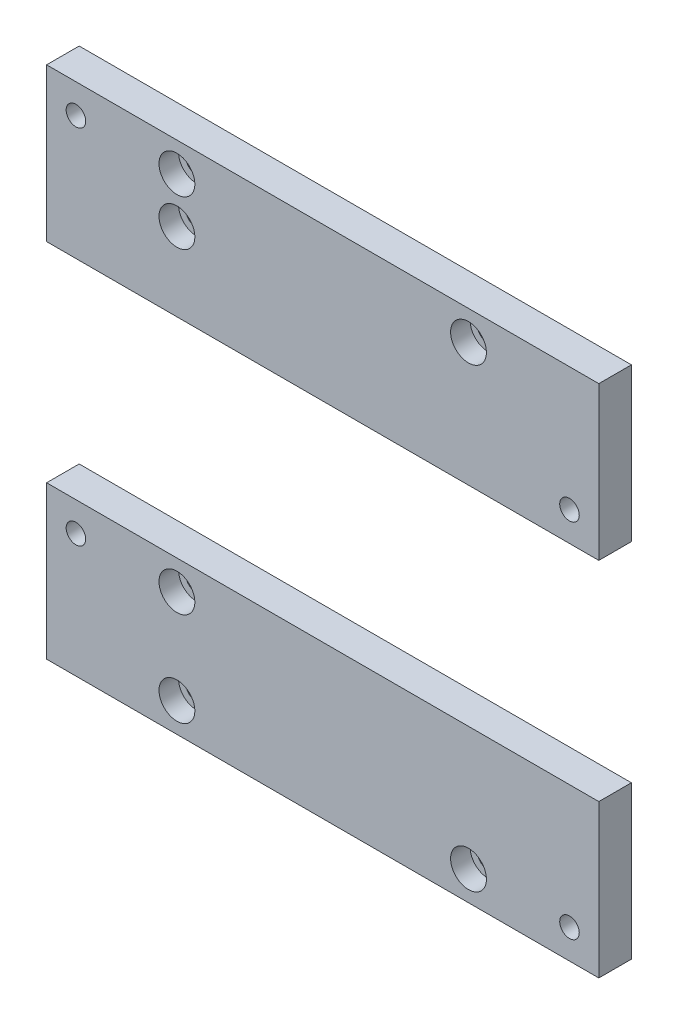
ISO-10303-21;
HEADER;
FILE_DESCRIPTION(('STEP AP214'),'2;1');
FILE_NAME('part.step','',(''),(''),'','','');
FILE_SCHEMA(('AUTOMOTIVE_DESIGN { 1 0 10303 214 1 1 1 1 }'));
ENDSEC;
DATA;
#1=APPLICATION_CONTEXT('core data for automotive mechanical design processes');
#2=APPLICATION_PROTOCOL_DEFINITION('international standard','automotive_design',2000,#1);
#3=PRODUCT_CONTEXT('',#1,'mechanical');
#4=PRODUCT('Part','Part','',(#3));
#5=PRODUCT_RELATED_PRODUCT_CATEGORY('part','',(#4));
#6=PRODUCT_DEFINITION_FORMATION('','',#4);
#7=PRODUCT_DEFINITION_CONTEXT('part definition',#1,'design');
#8=PRODUCT_DEFINITION('design','',#6,#7);
#9=PRODUCT_DEFINITION_SHAPE('','',#8);
#10=(LENGTH_UNIT() NAMED_UNIT(*) SI_UNIT(.MILLI.,.METRE.));
#11=(NAMED_UNIT(*) PLANE_ANGLE_UNIT() SI_UNIT($,.RADIAN.));
#12=(NAMED_UNIT(*) SI_UNIT($,.STERADIAN.) SOLID_ANGLE_UNIT());
#13=UNCERTAINTY_MEASURE_WITH_UNIT(LENGTH_MEASURE(1.E-05),#10,'distance_accuracy_value','');
#14=(GEOMETRIC_REPRESENTATION_CONTEXT(3) GLOBAL_UNCERTAINTY_ASSIGNED_CONTEXT((#13)) GLOBAL_UNIT_ASSIGNED_CONTEXT((#10,
#11,#12)) REPRESENTATION_CONTEXT('',''));
#15=CARTESIAN_POINT('',(0.,0.,0.));
#16=DIRECTION('',(0.,0.,1.));
#17=DIRECTION('',(1.,0.,0.));
#18=AXIS2_PLACEMENT_3D('',#15,#16,#17);
#19=CARTESIAN_POINT('',(-50.,79.0000000000001,10.));
#20=DIRECTION('',(1.,0.,0.));
#21=DIRECTION('',(0.,1.,0.));
#22=AXIS2_PLACEMENT_3D('',#19,#20,#21);
#23=PLANE('',#22);
#24=DIRECTION('',(0.,-1.,0.));
#25=VECTOR('',#24,1.);
#26=CARTESIAN_POINT('',(-50.,79.0000000000001,0.));
#27=LINE('',#26,#25);
#28=CARTESIAN_POINT('',(-50.,79.0000000000001,0.));
#29=VERTEX_POINT('',#28);
#30=CARTESIAN_POINT('',(-50.,32.,0.));
#31=VERTEX_POINT('',#30);
#32=EDGE_CURVE('E12',#29,#31,#27,.T.);
#33=ORIENTED_EDGE('',*,*,#32,.T.);
#34=DIRECTION('',(0.,0.,-1.));
#35=VECTOR('',#34,1.);
#36=CARTESIAN_POINT('',(-50.,32.,10.));
#37=LINE('',#36,#35);
#38=CARTESIAN_POINT('',(-50.,32.,10.));
#39=VERTEX_POINT('',#38);
#40=EDGE_CURVE('E119',#39,#31,#37,.T.);
#41=ORIENTED_EDGE('',*,*,#40,.F.);
#42=DIRECTION('',(0.,-1.,0.));
#43=VECTOR('',#42,1.);
#44=CARTESIAN_POINT('',(-50.,79.0000000000001,10.));
#45=LINE('',#44,#43);
#46=CARTESIAN_POINT('',(-50.,79.0000000000001,10.));
#47=VERTEX_POINT('',#46);
#48=EDGE_CURVE('E52',#47,#39,#45,.T.);
#49=ORIENTED_EDGE('',*,*,#48,.F.);
#50=DIRECTION('',(0.,0.,-1.));
#51=VECTOR('',#50,1.);
#52=CARTESIAN_POINT('',(-50.,79.0000000000001,10.));
#53=LINE('',#52,#51);
#54=EDGE_CURVE('E107',#47,#29,#53,.T.);
#55=ORIENTED_EDGE('',*,*,#54,.T.);
#56=EDGE_LOOP('',(#33,#41,#49,#55));
#57=FACE_BOUND('',#56,.T.);
#58=ADVANCED_FACE('F48',(#57),#23,.F.);
#59=CARTESIAN_POINT('',(-50.,32.,10.));
#60=DIRECTION('',(0.,1.,0.));
#61=DIRECTION('',(0.,0.,1.));
#62=AXIS2_PLACEMENT_3D('',#59,#60,#61);
#63=PLANE('',#62);
#64=DIRECTION('',(1.,0.,0.));
#65=VECTOR('',#64,1.);
#66=CARTESIAN_POINT('',(-50.,32.,0.));
#67=LINE('',#66,#65);
#68=CARTESIAN_POINT('',(119.5,32.,0.));
#69=VERTEX_POINT('',#68);
#70=EDGE_CURVE('E58',#31,#69,#67,.T.);
#71=ORIENTED_EDGE('',*,*,#70,.T.);
#72=DIRECTION('',(0.,0.,-1.));
#73=VECTOR('',#72,1.);
#74=CARTESIAN_POINT('',(119.5,32.,10.));
#75=LINE('',#74,#73);
#76=CARTESIAN_POINT('',(119.5,32.,10.));
#77=VERTEX_POINT('',#76);
#78=EDGE_CURVE('E103',#77,#69,#75,.T.);
#79=ORIENTED_EDGE('',*,*,#78,.F.);
#80=DIRECTION('',(1.,0.,0.));
#81=VECTOR('',#80,1.);
#82=CARTESIAN_POINT('',(-50.,32.,10.));
#83=LINE('',#82,#81);
#84=EDGE_CURVE('E82',#39,#77,#83,.T.);
#85=ORIENTED_EDGE('',*,*,#84,.F.);
#86=ORIENTED_EDGE('',*,*,#40,.T.);
#87=EDGE_LOOP('',(#71,#79,#85,#86));
#88=FACE_BOUND('',#87,.T.);
#89=ADVANCED_FACE('F202',(#88),#63,.F.);
#90=CARTESIAN_POINT('',(119.5,79.0000000000001,10.));
#91=DIRECTION('',(-1.,0.,0.));
#92=DIRECTION('',(0.,-1.,0.));
#93=AXIS2_PLACEMENT_3D('',#90,#91,#92);
#94=PLANE('',#93);
#95=DIRECTION('',(0.,1.,0.));
#96=VECTOR('',#95,1.);
#97=CARTESIAN_POINT('',(119.5,79.0000000000001,0.));
#98=LINE('',#97,#96);
#99=CARTESIAN_POINT('',(119.5,79.0000000000001,0.));
#100=VERTEX_POINT('',#99);
#101=EDGE_CURVE('E98',#69,#100,#98,.T.);
#102=ORIENTED_EDGE('',*,*,#101,.T.);
#103=DIRECTION('',(0.,0.,-1.));
#104=VECTOR('',#103,1.);
#105=CARTESIAN_POINT('',(119.5,79.0000000000001,10.));
#106=LINE('',#105,#104);
#107=CARTESIAN_POINT('',(119.5,79.0000000000001,10.));
#108=VERTEX_POINT('',#107);
#109=EDGE_CURVE('E101',#108,#100,#106,.T.);
#110=ORIENTED_EDGE('',*,*,#109,.F.);
#111=DIRECTION('',(0.,1.,0.));
#112=VECTOR('',#111,1.);
#113=CARTESIAN_POINT('',(119.5,79.0000000000001,10.));
#114=LINE('',#113,#112);
#115=EDGE_CURVE('E115',#77,#108,#114,.T.);
#116=ORIENTED_EDGE('',*,*,#115,.F.);
#117=ORIENTED_EDGE('',*,*,#78,.T.);
#118=EDGE_LOOP('',(#102,#110,#116,#117));
#119=FACE_BOUND('',#118,.T.);
#120=ADVANCED_FACE('F99',(#119),#94,.F.);
#121=CARTESIAN_POINT('',(-50.,79.0000000000001,10.));
#122=DIRECTION('',(0.,-1.,0.));
#123=DIRECTION('',(0.,0.,-1.));
#124=AXIS2_PLACEMENT_3D('',#121,#122,#123);
#125=PLANE('',#124);
#126=DIRECTION('',(-1.,0.,0.));
#127=VECTOR('',#126,1.);
#128=CARTESIAN_POINT('',(-50.,79.0000000000001,0.));
#129=LINE('',#128,#127);
#130=EDGE_CURVE('E92',#100,#29,#129,.T.);
#131=ORIENTED_EDGE('',*,*,#130,.T.);
#132=ORIENTED_EDGE('',*,*,#54,.F.);
#133=DIRECTION('',(-1.,0.,0.));
#134=VECTOR('',#133,1.);
#135=CARTESIAN_POINT('',(-50.,79.0000000000001,10.));
#136=LINE('',#135,#134);
#137=EDGE_CURVE('E106',#108,#47,#136,.T.);
#138=ORIENTED_EDGE('',*,*,#137,.F.);
#139=ORIENTED_EDGE('',*,*,#109,.T.);
#140=EDGE_LOOP('',(#131,#132,#138,#139));
#141=FACE_BOUND('',#140,.T.);
#142=ADVANCED_FACE('F105',(#141),#125,.F.);
#143=CARTESIAN_POINT('',(0.,0.,10.));
#144=DIRECTION('',(0.,0.,1.));
#145=DIRECTION('',(1.,0.,0.));
#146=AXIS2_PLACEMENT_3D('',#143,#144,#145);
#147=PLANE('',#146);
#148=CARTESIAN_POINT('',(-41.,70.0000000000001,10.));
#149=DIRECTION('',(0.,0.,1.));
#150=DIRECTION('',(1.,0.,0.));
#151=AXIS2_PLACEMENT_3D('',#148,#149,#150);
#152=CIRCLE('',#151,2.99999999999999);
#153=CARTESIAN_POINT('',(-38.,70.0000000000001,10.));
#154=VERTEX_POINT('',#153);
#155=EDGE_CURVE('E168',#154,#154,#152,.T.);
#156=ORIENTED_EDGE('',*,*,#155,.F.);
#157=EDGE_LOOP('',(#156));
#158=FACE_BOUND('',#157,.T.);
#159=CARTESIAN_POINT('',(110.5,41.,10.));
#160=DIRECTION('',(0.,0.,1.));
#161=DIRECTION('',(1.,0.,0.));
#162=AXIS2_PLACEMENT_3D('',#159,#160,#161);
#163=CIRCLE('',#162,2.99999999999999);
#164=CARTESIAN_POINT('',(113.5,41.,10.));
#165=VERTEX_POINT('',#164);
#166=EDGE_CURVE('E162',#165,#165,#163,.T.);
#167=ORIENTED_EDGE('',*,*,#166,.F.);
#168=EDGE_LOOP('',(#167));
#169=FACE_BOUND('',#168,.T.);
#170=CARTESIAN_POINT('',(79.5,70.0000000000001,10.));
#171=DIRECTION('',(0.,0.,1.));
#172=DIRECTION('',(1.,0.,0.));
#173=AXIS2_PLACEMENT_3D('',#170,#171,#172);
#174=CIRCLE('',#173,5.49999999999999);
#175=CARTESIAN_POINT('',(85.,70.0000000000001,10.));
#176=VERTEX_POINT('',#175);
#177=EDGE_CURVE('E156',#176,#176,#174,.T.);
#178=ORIENTED_EDGE('',*,*,#177,.F.);
#179=EDGE_LOOP('',(#178));
#180=FACE_BOUND('',#179,.T.);
#181=CARTESIAN_POINT('',(-10.,56.0000000000001,10.));
#182=DIRECTION('',(0.,0.,1.));
#183=DIRECTION('',(1.,0.,0.));
#184=AXIS2_PLACEMENT_3D('',#181,#182,#183);
#185=CIRCLE('',#184,5.49999999999999);
#186=CARTESIAN_POINT('',(-4.50000000000005,56.0000000000001,10.));
#187=VERTEX_POINT('',#186);
#188=EDGE_CURVE('E144',#187,#187,#185,.T.);
#189=ORIENTED_EDGE('',*,*,#188,.F.);
#190=EDGE_LOOP('',(#189));
#191=FACE_BOUND('',#190,.T.);
#192=CARTESIAN_POINT('',(-10.,70.0000000000001,10.));
#193=DIRECTION('',(0.,0.,1.));
#194=DIRECTION('',(1.,0.,0.));
#195=AXIS2_PLACEMENT_3D('',#192,#193,#194);
#196=CIRCLE('',#195,5.49999999999999);
#197=CARTESIAN_POINT('',(-4.50000000000004,70.0000000000001,10.));
#198=VERTEX_POINT('',#197);
#199=EDGE_CURVE('E132',#198,#198,#196,.T.);
#200=ORIENTED_EDGE('',*,*,#199,.F.);
#201=EDGE_LOOP('',(#200));
#202=FACE_BOUND('',#201,.T.);
#203=ORIENTED_EDGE('',*,*,#48,.T.);
#204=ORIENTED_EDGE('',*,*,#84,.T.);
#205=ORIENTED_EDGE('',*,*,#115,.T.);
#206=ORIENTED_EDGE('',*,*,#137,.T.);
#207=EDGE_LOOP('',(#203,#204,#205,#206));
#208=FACE_BOUND('',#207,.T.);
#209=ADVANCED_FACE('F50',(#158,#169,#180,#191,#202,#208),#147,.T.);
#210=CARTESIAN_POINT('',(0.,0.,0.));
#211=DIRECTION('',(0.,0.,1.));
#212=DIRECTION('',(1.,0.,0.));
#213=AXIS2_PLACEMENT_3D('',#210,#211,#212);
#214=PLANE('',#213);
#215=CARTESIAN_POINT('',(-41.,70.0000000000001,0.));
#216=DIRECTION('',(0.,0.,1.));
#217=DIRECTION('',(1.,0.,0.));
#218=AXIS2_PLACEMENT_3D('',#215,#216,#217);
#219=CIRCLE('',#218,2.99999999999999);
#220=CARTESIAN_POINT('',(-38.,70.0000000000001,0.));
#221=VERTEX_POINT('',#220);
#222=EDGE_CURVE('E165',#221,#221,#219,.T.);
#223=ORIENTED_EDGE('',*,*,#222,.T.);
#224=EDGE_LOOP('',(#223));
#225=FACE_BOUND('',#224,.T.);
#226=CARTESIAN_POINT('',(110.5,41.,0.));
#227=DIRECTION('',(0.,0.,1.));
#228=DIRECTION('',(1.,0.,0.));
#229=AXIS2_PLACEMENT_3D('',#226,#227,#228);
#230=CIRCLE('',#229,2.99999999999999);
#231=CARTESIAN_POINT('',(113.5,41.,0.));
#232=VERTEX_POINT('',#231);
#233=EDGE_CURVE('E159',#232,#232,#230,.T.);
#234=ORIENTED_EDGE('',*,*,#233,.T.);
#235=EDGE_LOOP('',(#234));
#236=FACE_BOUND('',#235,.T.);
#237=CARTESIAN_POINT('',(79.5,70.0000000000001,0.));
#238=DIRECTION('',(0.,0.,1.));
#239=DIRECTION('',(1.,0.,0.));
#240=AXIS2_PLACEMENT_3D('',#237,#238,#239);
#241=CIRCLE('',#240,3.30000000000001);
#242=CARTESIAN_POINT('',(82.8,70.0000000000001,0.));
#243=VERTEX_POINT('',#242);
#244=EDGE_CURVE('E147',#243,#243,#241,.T.);
#245=ORIENTED_EDGE('',*,*,#244,.T.);
#246=EDGE_LOOP('',(#245));
#247=FACE_BOUND('',#246,.T.);
#248=CARTESIAN_POINT('',(-10.,56.0000000000001,0.));
#249=DIRECTION('',(0.,0.,1.));
#250=DIRECTION('',(1.,0.,0.));
#251=AXIS2_PLACEMENT_3D('',#248,#249,#250);
#252=CIRCLE('',#251,3.30000000000001);
#253=CARTESIAN_POINT('',(-6.70000000000003,56.0000000000001,0.));
#254=VERTEX_POINT('',#253);
#255=EDGE_CURVE('E135',#254,#254,#252,.T.);
#256=ORIENTED_EDGE('',*,*,#255,.T.);
#257=EDGE_LOOP('',(#256));
#258=FACE_BOUND('',#257,.T.);
#259=CARTESIAN_POINT('',(-10.,70.0000000000001,0.));
#260=DIRECTION('',(0.,0.,1.));
#261=DIRECTION('',(1.,0.,0.));
#262=AXIS2_PLACEMENT_3D('',#259,#260,#261);
#263=CIRCLE('',#262,3.30000000000001);
#264=CARTESIAN_POINT('',(-6.70000000000003,70.0000000000001,0.));
#265=VERTEX_POINT('',#264);
#266=EDGE_CURVE('E120',#265,#265,#263,.T.);
#267=ORIENTED_EDGE('',*,*,#266,.T.);
#268=EDGE_LOOP('',(#267));
#269=FACE_BOUND('',#268,.T.);
#270=ORIENTED_EDGE('',*,*,#32,.F.);
#271=ORIENTED_EDGE('',*,*,#130,.F.);
#272=ORIENTED_EDGE('',*,*,#101,.F.);
#273=ORIENTED_EDGE('',*,*,#70,.F.);
#274=EDGE_LOOP('',(#270,#271,#272,#273));
#275=FACE_BOUND('',#274,.T.);
#276=ADVANCED_FACE('F109',(#225,#236,#247,#258,#269,#275),#214,.F.);
#277=CARTESIAN_POINT('',(-10.,70.0000000000001,10.));
#278=DIRECTION('',(0.,0.,1.));
#279=DIRECTION('',(1.,0.,0.));
#280=AXIS2_PLACEMENT_3D('',#277,#278,#279);
#281=CYLINDRICAL_SURFACE('',#280,3.30000000000001);
#282=ORIENTED_EDGE('',*,*,#266,.F.);
#283=EDGE_LOOP('',(#282));
#284=FACE_BOUND('',#283,.T.);
#285=CARTESIAN_POINT('',(-10.,70.0000000000001,4.));
#286=DIRECTION('',(0.,0.,1.));
#287=DIRECTION('',(1.,0.,0.));
#288=AXIS2_PLACEMENT_3D('',#285,#286,#287);
#289=CIRCLE('',#288,3.30000000000001);
#290=CARTESIAN_POINT('',(-6.70000000000003,70.0000000000001,4.));
#291=VERTEX_POINT('',#290);
#292=EDGE_CURVE('E124',#291,#291,#289,.T.);
#293=ORIENTED_EDGE('',*,*,#292,.T.);
#294=EDGE_LOOP('',(#293));
#295=FACE_BOUND('',#294,.T.);
#296=ADVANCED_FACE('F197',(#284,#295),#281,.F.);
#297=CARTESIAN_POINT('',(-6.70000000000003,70.0000000000001,4.));
#298=DIRECTION('',(0.,0.,-1.));
#299=DIRECTION('',(-1.,0.,0.));
#300=AXIS2_PLACEMENT_3D('',#297,#298,#299);
#301=PLANE('',#300);
#302=ORIENTED_EDGE('',*,*,#292,.F.);
#303=EDGE_LOOP('',(#302));
#304=FACE_BOUND('',#303,.T.);
#305=CARTESIAN_POINT('',(-10.,70.0000000000001,4.));
#306=DIRECTION('',(0.,0.,1.));
#307=DIRECTION('',(1.,0.,0.));
#308=AXIS2_PLACEMENT_3D('',#305,#306,#307);
#309=CIRCLE('',#308,5.5);
#310=CARTESIAN_POINT('',(-4.50000000000004,70.0000000000001,4.));
#311=VERTEX_POINT('',#310);
#312=EDGE_CURVE('E129',#311,#311,#309,.T.);
#313=ORIENTED_EDGE('',*,*,#312,.T.);
#314=EDGE_LOOP('',(#313));
#315=FACE_BOUND('',#314,.T.);
#316=ADVANCED_FACE('F187',(#304,#315),#301,.F.);
#317=CARTESIAN_POINT('',(-10.,70.0000000000001,10.));
#318=DIRECTION('',(0.,0.,1.));
#319=DIRECTION('',(1.,0.,0.));
#320=AXIS2_PLACEMENT_3D('',#317,#318,#319);
#321=CYLINDRICAL_SURFACE('',#320,5.5);
#322=ORIENTED_EDGE('',*,*,#312,.F.);
#323=EDGE_LOOP('',(#322));
#324=FACE_BOUND('',#323,.T.);
#325=ORIENTED_EDGE('',*,*,#199,.T.);
#326=EDGE_LOOP('',(#325));
#327=FACE_BOUND('',#326,.T.);
#328=ADVANCED_FACE('F184',(#324,#327),#321,.F.);
#329=CARTESIAN_POINT('',(-10.,56.0000000000001,10.));
#330=DIRECTION('',(0.,0.,1.));
#331=DIRECTION('',(1.,0.,0.));
#332=AXIS2_PLACEMENT_3D('',#329,#330,#331);
#333=CYLINDRICAL_SURFACE('',#332,3.30000000000001);
#334=ORIENTED_EDGE('',*,*,#255,.F.);
#335=EDGE_LOOP('',(#334));
#336=FACE_BOUND('',#335,.T.);
#337=CARTESIAN_POINT('',(-10.,56.0000000000001,4.));
#338=DIRECTION('',(0.,0.,1.));
#339=DIRECTION('',(1.,0.,0.));
#340=AXIS2_PLACEMENT_3D('',#337,#338,#339);
#341=CIRCLE('',#340,3.30000000000001);
#342=CARTESIAN_POINT('',(-6.70000000000003,56.0000000000001,4.));
#343=VERTEX_POINT('',#342);
#344=EDGE_CURVE('E138',#343,#343,#341,.T.);
#345=ORIENTED_EDGE('',*,*,#344,.T.);
#346=EDGE_LOOP('',(#345));
#347=FACE_BOUND('',#346,.T.);
#348=ADVANCED_FACE('F186',(#336,#347),#333,.F.);
#349=CARTESIAN_POINT('',(-6.70000000000003,56.0000000000001,4.));
#350=DIRECTION('',(0.,0.,-1.));
#351=DIRECTION('',(-1.,0.,0.));
#352=AXIS2_PLACEMENT_3D('',#349,#350,#351);
#353=PLANE('',#352);
#354=ORIENTED_EDGE('',*,*,#344,.F.);
#355=EDGE_LOOP('',(#354));
#356=FACE_BOUND('',#355,.T.);
#357=CARTESIAN_POINT('',(-10.,56.0000000000001,4.));
#358=DIRECTION('',(0.,0.,1.));
#359=DIRECTION('',(1.,0.,0.));
#360=AXIS2_PLACEMENT_3D('',#357,#358,#359);
#361=CIRCLE('',#360,5.5);
#362=CARTESIAN_POINT('',(-4.50000000000005,56.0000000000001,4.));
#363=VERTEX_POINT('',#362);
#364=EDGE_CURVE('E141',#363,#363,#361,.T.);
#365=ORIENTED_EDGE('',*,*,#364,.T.);
#366=EDGE_LOOP('',(#365));
#367=FACE_BOUND('',#366,.T.);
#368=ADVANCED_FACE('F194',(#356,#367),#353,.F.);
#369=CARTESIAN_POINT('',(-10.,56.0000000000001,10.));
#370=DIRECTION('',(0.,0.,1.));
#371=DIRECTION('',(1.,0.,0.));
#372=AXIS2_PLACEMENT_3D('',#369,#370,#371);
#373=CYLINDRICAL_SURFACE('',#372,5.5);
#374=ORIENTED_EDGE('',*,*,#364,.F.);
#375=EDGE_LOOP('',(#374));
#376=FACE_BOUND('',#375,.T.);
#377=ORIENTED_EDGE('',*,*,#188,.T.);
#378=EDGE_LOOP('',(#377));
#379=FACE_BOUND('',#378,.T.);
#380=ADVANCED_FACE('F237',(#376,#379),#373,.F.);
#381=CARTESIAN_POINT('',(79.5,70.0000000000001,10.));
#382=DIRECTION('',(0.,0.,1.));
#383=DIRECTION('',(1.,0.,0.));
#384=AXIS2_PLACEMENT_3D('',#381,#382,#383);
#385=CYLINDRICAL_SURFACE('',#384,3.30000000000001);
#386=ORIENTED_EDGE('',*,*,#244,.F.);
#387=EDGE_LOOP('',(#386));
#388=FACE_BOUND('',#387,.T.);
#389=CARTESIAN_POINT('',(79.5,70.0000000000001,4.));
#390=DIRECTION('',(0.,0.,1.));
#391=DIRECTION('',(1.,0.,0.));
#392=AXIS2_PLACEMENT_3D('',#389,#390,#391);
#393=CIRCLE('',#392,3.30000000000001);
#394=CARTESIAN_POINT('',(82.8,70.0000000000001,4.));
#395=VERTEX_POINT('',#394);
#396=EDGE_CURVE('E150',#395,#395,#393,.T.);
#397=ORIENTED_EDGE('',*,*,#396,.T.);
#398=EDGE_LOOP('',(#397));
#399=FACE_BOUND('',#398,.T.);
#400=ADVANCED_FACE('F243',(#388,#399),#385,.F.);
#401=CARTESIAN_POINT('',(82.8,70.0000000000001,4.));
#402=DIRECTION('',(0.,0.,-1.));
#403=DIRECTION('',(-1.,0.,0.));
#404=AXIS2_PLACEMENT_3D('',#401,#402,#403);
#405=PLANE('',#404);
#406=ORIENTED_EDGE('',*,*,#396,.F.);
#407=EDGE_LOOP('',(#406));
#408=FACE_BOUND('',#407,.T.);
#409=CARTESIAN_POINT('',(79.5,70.0000000000001,4.));
#410=DIRECTION('',(0.,0.,1.));
#411=DIRECTION('',(1.,0.,0.));
#412=AXIS2_PLACEMENT_3D('',#409,#410,#411);
#413=CIRCLE('',#412,5.49999999999999);
#414=CARTESIAN_POINT('',(85.,70.0000000000001,4.));
#415=VERTEX_POINT('',#414);
#416=EDGE_CURVE('E153',#415,#415,#413,.T.);
#417=ORIENTED_EDGE('',*,*,#416,.T.);
#418=EDGE_LOOP('',(#417));
#419=FACE_BOUND('',#418,.T.);
#420=ADVANCED_FACE('F248',(#408,#419),#405,.F.);
#421=CARTESIAN_POINT('',(79.5,70.0000000000001,10.));
#422=DIRECTION('',(0.,0.,1.));
#423=DIRECTION('',(1.,0.,0.));
#424=AXIS2_PLACEMENT_3D('',#421,#422,#423);
#425=CYLINDRICAL_SURFACE('',#424,5.49999999999999);
#426=ORIENTED_EDGE('',*,*,#416,.F.);
#427=EDGE_LOOP('',(#426));
#428=FACE_BOUND('',#427,.T.);
#429=ORIENTED_EDGE('',*,*,#177,.T.);
#430=EDGE_LOOP('',(#429));
#431=FACE_BOUND('',#430,.T.);
#432=ADVANCED_FACE('F254',(#428,#431),#425,.F.);
#433=CARTESIAN_POINT('',(110.5,41.,10.));
#434=DIRECTION('',(0.,0.,1.));
#435=DIRECTION('',(1.,0.,0.));
#436=AXIS2_PLACEMENT_3D('',#433,#434,#435);
#437=CYLINDRICAL_SURFACE('',#436,2.99999999999999);
#438=ORIENTED_EDGE('',*,*,#233,.F.);
#439=EDGE_LOOP('',(#438));
#440=FACE_BOUND('',#439,.T.);
#441=ORIENTED_EDGE('',*,*,#166,.T.);
#442=EDGE_LOOP('',(#441));
#443=FACE_BOUND('',#442,.T.);
#444=ADVANCED_FACE('F258',(#440,#443),#437,.F.);
#445=CARTESIAN_POINT('',(-41.,70.0000000000001,10.));
#446=DIRECTION('',(0.,0.,1.));
#447=DIRECTION('',(1.,0.,0.));
#448=AXIS2_PLACEMENT_3D('',#445,#446,#447);
#449=CYLINDRICAL_SURFACE('',#448,2.99999999999999);
#450=ORIENTED_EDGE('',*,*,#222,.F.);
#451=EDGE_LOOP('',(#450));
#452=FACE_BOUND('',#451,.T.);
#453=ORIENTED_EDGE('',*,*,#155,.T.);
#454=EDGE_LOOP('',(#453));
#455=FACE_BOUND('',#454,.T.);
#456=ADVANCED_FACE('F172',(#452,#455),#449,.F.);
#457=CLOSED_SHELL('',(#58,#89,#120,#142,#209,#276,#296,#316,#328,#348,#368,#380,#400,#420,#432,
#444,#456));
#458=MANIFOLD_SOLID_BREP('B2',#457);
#459=CARTESIAN_POINT('',(-50.,-32.1,10.));
#460=DIRECTION('',(1.,0.,0.));
#461=DIRECTION('',(0.,1.,0.));
#462=AXIS2_PLACEMENT_3D('',#459,#460,#461);
#463=PLANE('',#462);
#464=DIRECTION('',(0.,-1.,0.));
#465=VECTOR('',#464,1.);
#466=CARTESIAN_POINT('',(-50.,-32.1,0.));
#467=LINE('',#466,#465);
#468=CARTESIAN_POINT('',(-50.,-32.1,0.));
#469=VERTEX_POINT('',#468);
#470=CARTESIAN_POINT('',(-50.,-79.,0.));
#471=VERTEX_POINT('',#470);
#472=EDGE_CURVE('E464',#469,#471,#467,.T.);
#473=ORIENTED_EDGE('',*,*,#472,.T.);
#474=DIRECTION('',(0.,0.,-1.));
#475=VECTOR('',#474,1.);
#476=CARTESIAN_POINT('',(-50.,-79.,10.));
#477=LINE('',#476,#475);
#478=CARTESIAN_POINT('',(-50.,-79.,10.));
#479=VERTEX_POINT('',#478);
#480=EDGE_CURVE('E46',#479,#471,#477,.T.);
#481=ORIENTED_EDGE('',*,*,#480,.F.);
#482=DIRECTION('',(0.,-1.,0.));
#483=VECTOR('',#482,1.);
#484=CARTESIAN_POINT('',(-50.,-32.1,10.));
#485=LINE('',#484,#483);
#486=CARTESIAN_POINT('',(-50.,-32.1,10.));
#487=VERTEX_POINT('',#486);
#488=EDGE_CURVE('E452',#487,#479,#485,.T.);
#489=ORIENTED_EDGE('',*,*,#488,.F.);
#490=DIRECTION('',(0.,0.,-1.));
#491=VECTOR('',#490,1.);
#492=CARTESIAN_POINT('',(-50.,-32.1,10.));
#493=LINE('',#492,#491);
#494=EDGE_CURVE('E460',#487,#469,#493,.T.);
#495=ORIENTED_EDGE('',*,*,#494,.T.);
#496=EDGE_LOOP('',(#473,#481,#489,#495));
#497=FACE_BOUND('',#496,.T.);
#498=ADVANCED_FACE('F401',(#497),#463,.F.);
#499=CARTESIAN_POINT('',(-50.,-79.,10.));
#500=DIRECTION('',(0.,1.,0.));
#501=DIRECTION('',(0.,0.,1.));
#502=AXIS2_PLACEMENT_3D('',#499,#500,#501);
#503=PLANE('',#502);
#504=DIRECTION('',(1.,0.,0.));
#505=VECTOR('',#504,1.);
#506=CARTESIAN_POINT('',(-50.,-79.,0.));
#507=LINE('',#506,#505);
#508=CARTESIAN_POINT('',(119.5,-79.,0.));
#509=VERTEX_POINT('',#508);
#510=EDGE_CURVE('E456',#471,#509,#507,.T.);
#511=ORIENTED_EDGE('',*,*,#510,.T.);
#512=DIRECTION('',(0.,0.,-1.));
#513=VECTOR('',#512,1.);
#514=CARTESIAN_POINT('',(119.5,-79.,10.));
#515=LINE('',#514,#513);
#516=CARTESIAN_POINT('',(119.5,-79.,10.));
#517=VERTEX_POINT('',#516);
#518=EDGE_CURVE('E409',#517,#509,#515,.T.);
#519=ORIENTED_EDGE('',*,*,#518,.F.);
#520=DIRECTION('',(1.,0.,0.));
#521=VECTOR('',#520,1.);
#522=CARTESIAN_POINT('',(-50.,-79.,10.));
#523=LINE('',#522,#521);
#524=EDGE_CURVE('E447',#479,#517,#523,.T.);
#525=ORIENTED_EDGE('',*,*,#524,.F.);
#526=ORIENTED_EDGE('',*,*,#480,.T.);
#527=EDGE_LOOP('',(#511,#519,#525,#526));
#528=FACE_BOUND('',#527,.T.);
#529=ADVANCED_FACE('F455',(#528),#503,.F.);
#530=CARTESIAN_POINT('',(119.5,-32.1,10.));
#531=DIRECTION('',(-1.,0.,0.));
#532=DIRECTION('',(0.,-1.,0.));
#533=AXIS2_PLACEMENT_3D('',#530,#531,#532);
#534=PLANE('',#533);
#535=DIRECTION('',(0.,1.,0.));
#536=VECTOR('',#535,1.);
#537=CARTESIAN_POINT('',(119.5,-32.1,0.));
#538=LINE('',#537,#536);
#539=CARTESIAN_POINT('',(119.5,-32.1,0.));
#540=VERTEX_POINT('',#539);
#541=EDGE_CURVE('E434',#509,#540,#538,.T.);
#542=ORIENTED_EDGE('',*,*,#541,.T.);
#543=DIRECTION('',(0.,0.,-1.));
#544=VECTOR('',#543,1.);
#545=CARTESIAN_POINT('',(119.5,-32.1,10.));
#546=LINE('',#545,#544);
#547=CARTESIAN_POINT('',(119.5,-32.1,10.));
#548=VERTEX_POINT('',#547);
#549=EDGE_CURVE('E457',#548,#540,#546,.T.);
#550=ORIENTED_EDGE('',*,*,#549,.F.);
#551=DIRECTION('',(0.,1.,0.));
#552=VECTOR('',#551,1.);
#553=CARTESIAN_POINT('',(119.5,-32.1,10.));
#554=LINE('',#553,#552);
#555=EDGE_CURVE('E450',#517,#548,#554,.T.);
#556=ORIENTED_EDGE('',*,*,#555,.F.);
#557=ORIENTED_EDGE('',*,*,#518,.T.);
#558=EDGE_LOOP('',(#542,#550,#556,#557));
#559=FACE_BOUND('',#558,.T.);
#560=ADVANCED_FACE('F458',(#559),#534,.F.);
#561=CARTESIAN_POINT('',(-50.,-32.1,10.));
#562=DIRECTION('',(0.,-1.,0.));
#563=DIRECTION('',(0.,0.,-1.));
#564=AXIS2_PLACEMENT_3D('',#561,#562,#563);
#565=PLANE('',#564);
#566=DIRECTION('',(-1.,0.,0.));
#567=VECTOR('',#566,1.);
#568=CARTESIAN_POINT('',(-50.,-32.1,0.));
#569=LINE('',#568,#567);
#570=EDGE_CURVE('E440',#540,#469,#569,.T.);
#571=ORIENTED_EDGE('',*,*,#570,.T.);
#572=ORIENTED_EDGE('',*,*,#494,.F.);
#573=DIRECTION('',(-1.,0.,0.));
#574=VECTOR('',#573,1.);
#575=CARTESIAN_POINT('',(-50.,-32.1,10.));
#576=LINE('',#575,#574);
#577=EDGE_CURVE('E417',#548,#487,#576,.T.);
#578=ORIENTED_EDGE('',*,*,#577,.F.);
#579=ORIENTED_EDGE('',*,*,#549,.T.);
#580=EDGE_LOOP('',(#571,#572,#578,#579));
#581=FACE_BOUND('',#580,.T.);
#582=ADVANCED_FACE('F472',(#581),#565,.F.);
#583=CARTESIAN_POINT('',(0.,0.,10.));
#584=DIRECTION('',(0.,0.,1.));
#585=DIRECTION('',(1.,0.,0.));
#586=AXIS2_PLACEMENT_3D('',#583,#584,#585);
#587=PLANE('',#586);
#588=CARTESIAN_POINT('',(-41.,-41.1,10.));
#589=DIRECTION('',(0.,0.,1.));
#590=DIRECTION('',(1.,0.,0.));
#591=AXIS2_PLACEMENT_3D('',#588,#589,#590);
#592=CIRCLE('',#591,2.99999999999999);
#593=CARTESIAN_POINT('',(-38.,-41.1,10.));
#594=VERTEX_POINT('',#593);
#595=EDGE_CURVE('E522',#594,#594,#592,.T.);
#596=ORIENTED_EDGE('',*,*,#595,.F.);
#597=EDGE_LOOP('',(#596));
#598=FACE_BOUND('',#597,.T.);
#599=CARTESIAN_POINT('',(110.5,-70.,10.));
#600=DIRECTION('',(0.,0.,1.));
#601=DIRECTION('',(1.,0.,0.));
#602=AXIS2_PLACEMENT_3D('',#599,#600,#601);
#603=CIRCLE('',#602,2.99999999999999);
#604=CARTESIAN_POINT('',(113.5,-70.,10.));
#605=VERTEX_POINT('',#604);
#606=EDGE_CURVE('E516',#605,#605,#603,.T.);
#607=ORIENTED_EDGE('',*,*,#606,.F.);
#608=EDGE_LOOP('',(#607));
#609=FACE_BOUND('',#608,.T.);
#610=CARTESIAN_POINT('',(79.5,-70.,10.));
#611=DIRECTION('',(0.,0.,1.));
#612=DIRECTION('',(1.,0.,0.));
#613=AXIS2_PLACEMENT_3D('',#610,#611,#612);
#614=CIRCLE('',#613,5.49999999999999);
#615=CARTESIAN_POINT('',(85.,-70.,10.));
#616=VERTEX_POINT('',#615);
#617=EDGE_CURVE('E510',#616,#616,#614,.T.);
#618=ORIENTED_EDGE('',*,*,#617,.F.);
#619=EDGE_LOOP('',(#618));
#620=FACE_BOUND('',#619,.T.);
#621=CARTESIAN_POINT('',(-10.,-70.,10.));
#622=DIRECTION('',(0.,0.,1.));
#623=DIRECTION('',(1.,0.,0.));
#624=AXIS2_PLACEMENT_3D('',#621,#622,#623);
#625=CIRCLE('',#624,5.49999999999999);
#626=CARTESIAN_POINT('',(-4.50000000000004,-70.,10.));
#627=VERTEX_POINT('',#626);
#628=EDGE_CURVE('E498',#627,#627,#625,.T.);
#629=ORIENTED_EDGE('',*,*,#628,.F.);
#630=EDGE_LOOP('',(#629));
#631=FACE_BOUND('',#630,.T.);
#632=CARTESIAN_POINT('',(-10.,-41.1,10.));
#633=DIRECTION('',(0.,0.,1.));
#634=DIRECTION('',(1.,0.,0.));
#635=AXIS2_PLACEMENT_3D('',#632,#633,#634);
#636=CIRCLE('',#635,5.49999999999999);
#637=CARTESIAN_POINT('',(-4.50000000000004,-41.1,10.));
#638=VERTEX_POINT('',#637);
#639=EDGE_CURVE('E486',#638,#638,#636,.T.);
#640=ORIENTED_EDGE('',*,*,#639,.F.);
#641=EDGE_LOOP('',(#640));
#642=FACE_BOUND('',#641,.T.);
#643=ORIENTED_EDGE('',*,*,#488,.T.);
#644=ORIENTED_EDGE('',*,*,#524,.T.);
#645=ORIENTED_EDGE('',*,*,#555,.T.);
#646=ORIENTED_EDGE('',*,*,#577,.T.);
#647=EDGE_LOOP('',(#643,#644,#645,#646));
#648=FACE_BOUND('',#647,.T.);
#649=ADVANCED_FACE('F448',(#598,#609,#620,#631,#642,#648),#587,.T.);
#650=CARTESIAN_POINT('',(0.,0.,0.));
#651=DIRECTION('',(0.,0.,1.));
#652=DIRECTION('',(1.,0.,0.));
#653=AXIS2_PLACEMENT_3D('',#650,#651,#652);
#654=PLANE('',#653);
#655=CARTESIAN_POINT('',(-41.,-41.1,0.));
#656=DIRECTION('',(0.,0.,1.));
#657=DIRECTION('',(1.,0.,0.));
#658=AXIS2_PLACEMENT_3D('',#655,#656,#657);
#659=CIRCLE('',#658,2.99999999999999);
#660=CARTESIAN_POINT('',(-38.,-41.1,0.));
#661=VERTEX_POINT('',#660);
#662=EDGE_CURVE('E519',#661,#661,#659,.T.);
#663=ORIENTED_EDGE('',*,*,#662,.T.);
#664=EDGE_LOOP('',(#663));
#665=FACE_BOUND('',#664,.T.);
#666=CARTESIAN_POINT('',(110.5,-70.,0.));
#667=DIRECTION('',(0.,0.,1.));
#668=DIRECTION('',(1.,0.,0.));
#669=AXIS2_PLACEMENT_3D('',#666,#667,#668);
#670=CIRCLE('',#669,2.99999999999999);
#671=CARTESIAN_POINT('',(113.5,-70.,0.));
#672=VERTEX_POINT('',#671);
#673=EDGE_CURVE('E513',#672,#672,#670,.T.);
#674=ORIENTED_EDGE('',*,*,#673,.T.);
#675=EDGE_LOOP('',(#674));
#676=FACE_BOUND('',#675,.T.);
#677=CARTESIAN_POINT('',(79.5,-70.,0.));
#678=DIRECTION('',(0.,0.,1.));
#679=DIRECTION('',(1.,0.,0.));
#680=AXIS2_PLACEMENT_3D('',#677,#678,#679);
#681=CIRCLE('',#680,3.30000000000001);
#682=CARTESIAN_POINT('',(82.8,-70.,0.));
#683=VERTEX_POINT('',#682);
#684=EDGE_CURVE('E501',#683,#683,#681,.T.);
#685=ORIENTED_EDGE('',*,*,#684,.T.);
#686=EDGE_LOOP('',(#685));
#687=FACE_BOUND('',#686,.T.);
#688=CARTESIAN_POINT('',(-10.,-70.,0.));
#689=DIRECTION('',(0.,0.,1.));
#690=DIRECTION('',(1.,0.,0.));
#691=AXIS2_PLACEMENT_3D('',#688,#689,#690);
#692=CIRCLE('',#691,3.30000000000001);
#693=CARTESIAN_POINT('',(-6.70000000000002,-70.,0.));
#694=VERTEX_POINT('',#693);
#695=EDGE_CURVE('E489',#694,#694,#692,.T.);
#696=ORIENTED_EDGE('',*,*,#695,.T.);
#697=EDGE_LOOP('',(#696));
#698=FACE_BOUND('',#697,.T.);
#699=CARTESIAN_POINT('',(-10.,-41.1,0.));
#700=DIRECTION('',(0.,0.,1.));
#701=DIRECTION('',(1.,0.,0.));
#702=AXIS2_PLACEMENT_3D('',#699,#700,#701);
#703=CIRCLE('',#702,3.30000000000001);
#704=CARTESIAN_POINT('',(-6.70000000000002,-41.1,0.));
#705=VERTEX_POINT('',#704);
#706=EDGE_CURVE('E467',#705,#705,#703,.T.);
#707=ORIENTED_EDGE('',*,*,#706,.T.);
#708=EDGE_LOOP('',(#707));
#709=FACE_BOUND('',#708,.T.);
#710=ORIENTED_EDGE('',*,*,#472,.F.);
#711=ORIENTED_EDGE('',*,*,#570,.F.);
#712=ORIENTED_EDGE('',*,*,#541,.F.);
#713=ORIENTED_EDGE('',*,*,#510,.F.);
#714=EDGE_LOOP('',(#710,#711,#712,#713));
#715=FACE_BOUND('',#714,.T.);
#716=ADVANCED_FACE('F475',(#665,#676,#687,#698,#709,#715),#654,.F.);
#717=CARTESIAN_POINT('',(-10.,-41.1,10.));
#718=DIRECTION('',(0.,0.,1.));
#719=DIRECTION('',(1.,0.,0.));
#720=AXIS2_PLACEMENT_3D('',#717,#718,#719);
#721=CYLINDRICAL_SURFACE('',#720,3.30000000000001);
#722=ORIENTED_EDGE('',*,*,#706,.F.);
#723=EDGE_LOOP('',(#722));
#724=FACE_BOUND('',#723,.T.);
#725=CARTESIAN_POINT('',(-10.,-41.1,4.));
#726=DIRECTION('',(0.,0.,1.));
#727=DIRECTION('',(1.,0.,0.));
#728=AXIS2_PLACEMENT_3D('',#725,#726,#727);
#729=CIRCLE('',#728,3.30000000000001);
#730=CARTESIAN_POINT('',(-6.70000000000002,-41.1,4.));
#731=VERTEX_POINT('',#730);
#732=EDGE_CURVE('E480',#731,#731,#729,.T.);
#733=ORIENTED_EDGE('',*,*,#732,.T.);
#734=EDGE_LOOP('',(#733));
#735=FACE_BOUND('',#734,.T.);
#736=ADVANCED_FACE('F552',(#724,#735),#721,.F.);
#737=CARTESIAN_POINT('',(-6.70000000000002,-41.1,4.));
#738=DIRECTION('',(0.,0.,-1.));
#739=DIRECTION('',(-1.,0.,0.));
#740=AXIS2_PLACEMENT_3D('',#737,#738,#739);
#741=PLANE('',#740);
#742=ORIENTED_EDGE('',*,*,#732,.F.);
#743=EDGE_LOOP('',(#742));
#744=FACE_BOUND('',#743,.T.);
#745=CARTESIAN_POINT('',(-10.,-41.1,4.));
#746=DIRECTION('',(0.,0.,1.));
#747=DIRECTION('',(1.,0.,0.));
#748=AXIS2_PLACEMENT_3D('',#745,#746,#747);
#749=CIRCLE('',#748,5.5);
#750=CARTESIAN_POINT('',(-4.50000000000004,-41.1,4.));
#751=VERTEX_POINT('',#750);
#752=EDGE_CURVE('E483',#751,#751,#749,.T.);
#753=ORIENTED_EDGE('',*,*,#752,.T.);
#754=EDGE_LOOP('',(#753));
#755=FACE_BOUND('',#754,.T.);
#756=ADVANCED_FACE('F542',(#744,#755),#741,.F.);
#757=CARTESIAN_POINT('',(-10.,-41.1,10.));
#758=DIRECTION('',(0.,0.,1.));
#759=DIRECTION('',(1.,0.,0.));
#760=AXIS2_PLACEMENT_3D('',#757,#758,#759);
#761=CYLINDRICAL_SURFACE('',#760,5.5);
#762=ORIENTED_EDGE('',*,*,#752,.F.);
#763=EDGE_LOOP('',(#762));
#764=FACE_BOUND('',#763,.T.);
#765=ORIENTED_EDGE('',*,*,#639,.T.);
#766=EDGE_LOOP('',(#765));
#767=FACE_BOUND('',#766,.T.);
#768=ADVANCED_FACE('F539',(#764,#767),#761,.F.);
#769=CARTESIAN_POINT('',(-10.,-70.,10.));
#770=DIRECTION('',(0.,0.,1.));
#771=DIRECTION('',(1.,0.,0.));
#772=AXIS2_PLACEMENT_3D('',#769,#770,#771);
#773=CYLINDRICAL_SURFACE('',#772,3.30000000000001);
#774=ORIENTED_EDGE('',*,*,#695,.F.);
#775=EDGE_LOOP('',(#774));
#776=FACE_BOUND('',#775,.T.);
#777=CARTESIAN_POINT('',(-10.,-70.,4.));
#778=DIRECTION('',(0.,0.,1.));
#779=DIRECTION('',(1.,0.,0.));
#780=AXIS2_PLACEMENT_3D('',#777,#778,#779);
#781=CIRCLE('',#780,3.30000000000001);
#782=CARTESIAN_POINT('',(-6.70000000000002,-70.,4.));
#783=VERTEX_POINT('',#782);
#784=EDGE_CURVE('E492',#783,#783,#781,.T.);
#785=ORIENTED_EDGE('',*,*,#784,.T.);
#786=EDGE_LOOP('',(#785));
#787=FACE_BOUND('',#786,.T.);
#788=ADVANCED_FACE('F541',(#776,#787),#773,.F.);
#789=CARTESIAN_POINT('',(-6.70000000000002,-70.,4.));
#790=DIRECTION('',(0.,0.,-1.));
#791=DIRECTION('',(-1.,0.,0.));
#792=AXIS2_PLACEMENT_3D('',#789,#790,#791);
#793=PLANE('',#792);
#794=ORIENTED_EDGE('',*,*,#784,.F.);
#795=EDGE_LOOP('',(#794));
#796=FACE_BOUND('',#795,.T.);
#797=CARTESIAN_POINT('',(-10.,-70.,4.));
#798=DIRECTION('',(0.,0.,1.));
#799=DIRECTION('',(1.,0.,0.));
#800=AXIS2_PLACEMENT_3D('',#797,#798,#799);
#801=CIRCLE('',#800,5.5);
#802=CARTESIAN_POINT('',(-4.50000000000003,-70.,4.));
#803=VERTEX_POINT('',#802);
#804=EDGE_CURVE('E495',#803,#803,#801,.T.);
#805=ORIENTED_EDGE('',*,*,#804,.T.);
#806=EDGE_LOOP('',(#805));
#807=FACE_BOUND('',#806,.T.);
#808=ADVANCED_FACE('F549',(#796,#807),#793,.F.);
#809=CARTESIAN_POINT('',(-10.,-70.,10.));
#810=DIRECTION('',(0.,0.,1.));
#811=DIRECTION('',(1.,0.,0.));
#812=AXIS2_PLACEMENT_3D('',#809,#810,#811);
#813=CYLINDRICAL_SURFACE('',#812,5.5);
#814=ORIENTED_EDGE('',*,*,#804,.F.);
#815=EDGE_LOOP('',(#814));
#816=FACE_BOUND('',#815,.T.);
#817=ORIENTED_EDGE('',*,*,#628,.T.);
#818=EDGE_LOOP('',(#817));
#819=FACE_BOUND('',#818,.T.);
#820=ADVANCED_FACE('F610',(#816,#819),#813,.F.);
#821=CARTESIAN_POINT('',(79.5,-70.,10.));
#822=DIRECTION('',(0.,0.,1.));
#823=DIRECTION('',(1.,0.,0.));
#824=AXIS2_PLACEMENT_3D('',#821,#822,#823);
#825=CYLINDRICAL_SURFACE('',#824,3.30000000000001);
#826=ORIENTED_EDGE('',*,*,#684,.F.);
#827=EDGE_LOOP('',(#826));
#828=FACE_BOUND('',#827,.T.);
#829=CARTESIAN_POINT('',(79.5,-70.,4.));
#830=DIRECTION('',(0.,0.,1.));
#831=DIRECTION('',(1.,0.,0.));
#832=AXIS2_PLACEMENT_3D('',#829,#830,#831);
#833=CIRCLE('',#832,3.30000000000001);
#834=CARTESIAN_POINT('',(82.8,-70.,4.));
#835=VERTEX_POINT('',#834);
#836=EDGE_CURVE('E504',#835,#835,#833,.T.);
#837=ORIENTED_EDGE('',*,*,#836,.T.);
#838=EDGE_LOOP('',(#837));
#839=FACE_BOUND('',#838,.T.);
#840=ADVANCED_FACE('F621',(#828,#839),#825,.F.);
#841=CARTESIAN_POINT('',(82.8,-70.,4.));
#842=DIRECTION('',(0.,0.,-1.));
#843=DIRECTION('',(-1.,0.,0.));
#844=AXIS2_PLACEMENT_3D('',#841,#842,#843);
#845=PLANE('',#844);
#846=ORIENTED_EDGE('',*,*,#836,.F.);
#847=EDGE_LOOP('',(#846));
#848=FACE_BOUND('',#847,.T.);
#849=CARTESIAN_POINT('',(79.5,-70.,4.));
#850=DIRECTION('',(0.,0.,1.));
#851=DIRECTION('',(1.,0.,0.));
#852=AXIS2_PLACEMENT_3D('',#849,#850,#851);
#853=CIRCLE('',#852,5.49999999999999);
#854=CARTESIAN_POINT('',(85.,-70.,4.));
#855=VERTEX_POINT('',#854);
#856=EDGE_CURVE('E507',#855,#855,#853,.T.);
#857=ORIENTED_EDGE('',*,*,#856,.T.);
#858=EDGE_LOOP('',(#857));
#859=FACE_BOUND('',#858,.T.);
#860=ADVANCED_FACE('F632',(#848,#859),#845,.F.);
#861=CARTESIAN_POINT('',(79.5,-70.,10.));
#862=DIRECTION('',(0.,0.,1.));
#863=DIRECTION('',(1.,0.,0.));
#864=AXIS2_PLACEMENT_3D('',#861,#862,#863);
#865=CYLINDRICAL_SURFACE('',#864,5.49999999999999);
#866=ORIENTED_EDGE('',*,*,#856,.F.);
#867=EDGE_LOOP('',(#866));
#868=FACE_BOUND('',#867,.T.);
#869=ORIENTED_EDGE('',*,*,#617,.T.);
#870=EDGE_LOOP('',(#869));
#871=FACE_BOUND('',#870,.T.);
#872=ADVANCED_FACE('F643',(#868,#871),#865,.F.);
#873=CARTESIAN_POINT('',(110.5,-70.,10.));
#874=DIRECTION('',(0.,0.,1.));
#875=DIRECTION('',(1.,0.,0.));
#876=AXIS2_PLACEMENT_3D('',#873,#874,#875);
#877=CYLINDRICAL_SURFACE('',#876,2.99999999999999);
#878=ORIENTED_EDGE('',*,*,#673,.F.);
#879=EDGE_LOOP('',(#878));
#880=FACE_BOUND('',#879,.T.);
#881=ORIENTED_EDGE('',*,*,#606,.T.);
#882=EDGE_LOOP('',(#881));
#883=FACE_BOUND('',#882,.T.);
#884=ADVANCED_FACE('F653',(#880,#883),#877,.F.);
#885=CARTESIAN_POINT('',(-41.,-41.1,10.));
#886=DIRECTION('',(0.,0.,1.));
#887=DIRECTION('',(1.,0.,0.));
#888=AXIS2_PLACEMENT_3D('',#885,#886,#887);
#889=CYLINDRICAL_SURFACE('',#888,2.99999999999999);
#890=ORIENTED_EDGE('',*,*,#662,.F.);
#891=EDGE_LOOP('',(#890));
#892=FACE_BOUND('',#891,.T.);
#893=ORIENTED_EDGE('',*,*,#595,.T.);
#894=EDGE_LOOP('',(#893));
#895=FACE_BOUND('',#894,.T.);
#896=ADVANCED_FACE('F526',(#892,#895),#889,.F.);
#897=CLOSED_SHELL('',(#498,#529,#560,#582,#649,#716,#736,#756,#768,#788,#808,#820,#840,#860,
#872,#884,#896));
#898=MANIFOLD_SOLID_BREP('B6',#897);
#899=ADVANCED_BREP_SHAPE_REPRESENTATION('',(#18,#458,#898),#14);
#900=SHAPE_DEFINITION_REPRESENTATION(#9,#899);
ENDSEC;
END-ISO-10303-21;
